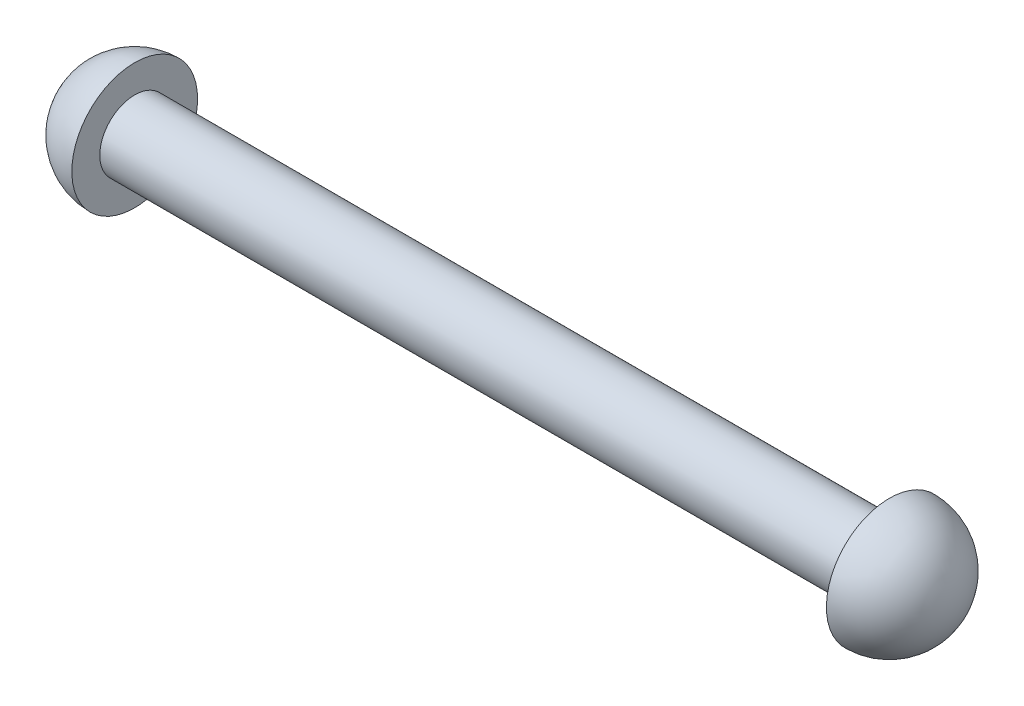
ISO-10303-21;
HEADER;
FILE_DESCRIPTION(('STEP AP214'),'2;1');
FILE_NAME('part.step','',(''),(''),'','','');
FILE_SCHEMA(('AUTOMOTIVE_DESIGN { 1 0 10303 214 1 1 1 1 }'));
ENDSEC;
DATA;
#1=APPLICATION_CONTEXT('core data for automotive mechanical design processes');
#2=APPLICATION_PROTOCOL_DEFINITION('international standard','automotive_design',2000,#1);
#3=PRODUCT_CONTEXT('',#1,'mechanical');
#4=PRODUCT('Part','Part','',(#3));
#5=PRODUCT_RELATED_PRODUCT_CATEGORY('part','',(#4));
#6=PRODUCT_DEFINITION_FORMATION('','',#4);
#7=PRODUCT_DEFINITION_CONTEXT('part definition',#1,'design');
#8=PRODUCT_DEFINITION('design','',#6,#7);
#9=PRODUCT_DEFINITION_SHAPE('','',#8);
#10=(LENGTH_UNIT() NAMED_UNIT(*) SI_UNIT(.MILLI.,.METRE.));
#11=(NAMED_UNIT(*) PLANE_ANGLE_UNIT() SI_UNIT($,.RADIAN.));
#12=(NAMED_UNIT(*) SI_UNIT($,.STERADIAN.) SOLID_ANGLE_UNIT());
#13=UNCERTAINTY_MEASURE_WITH_UNIT(LENGTH_MEASURE(1.E-05),#10,'distance_accuracy_value','');
#14=(GEOMETRIC_REPRESENTATION_CONTEXT(3) GLOBAL_UNCERTAINTY_ASSIGNED_CONTEXT((#13)) GLOBAL_UNIT_ASSIGNED_CONTEXT((#10,
#11,#12)) REPRESENTATION_CONTEXT('',''));
#15=CARTESIAN_POINT('',(0.,0.,0.));
#16=DIRECTION('',(0.,0.,1.));
#17=DIRECTION('',(1.,0.,0.));
#18=AXIS2_PLACEMENT_3D('',#15,#16,#17);
#19=CARTESIAN_POINT('',(34.29,3.17499999999999,0.));
#20=DIRECTION('',(-1.,0.,0.));
#21=DIRECTION('',(0.,0.,1.));
#22=AXIS2_PLACEMENT_3D('',#19,#20,#21);
#23=PLANE('',#22);
#24=CARTESIAN_POINT('',(34.29,0.,0.));
#25=DIRECTION('',(1.,0.,0.));
#26=DIRECTION('',(0.,0.,-1.));
#27=AXIS2_PLACEMENT_3D('',#24,#25,#26);
#28=CIRCLE('',#27,3.17500000000001);
#29=CARTESIAN_POINT('',(34.29,0.,-3.17500000000001));
#30=VERTEX_POINT('',#29);
#31=EDGE_CURVE('E58',#30,#30,#28,.T.);
#32=ORIENTED_EDGE('',*,*,#31,.T.);
#33=EDGE_LOOP('',(#32));
#34=FACE_BOUND('',#33,.T.);
#35=CARTESIAN_POINT('',(34.29,0.,0.));
#36=DIRECTION('',(1.,0.,0.));
#37=DIRECTION('',(0.,0.,-1.));
#38=AXIS2_PLACEMENT_3D('',#35,#36,#37);
#39=CIRCLE('',#38,5.71500000000001);
#40=CARTESIAN_POINT('',(34.29,0.,-5.71500000000001));
#41=VERTEX_POINT('',#40);
#42=EDGE_CURVE('E10',#41,#41,#39,.T.);
#43=ORIENTED_EDGE('',*,*,#42,.F.);
#44=EDGE_LOOP('',(#43));
#45=FACE_BOUND('',#44,.T.);
#46=ADVANCED_FACE('F41',(#34,#45),#23,.T.);
#47=CARTESIAN_POINT('',(34.29,0.,0.));
#48=DIRECTION('',(1.,0.,0.));
#49=DIRECTION('',(0.,-1.,0.));
#50=AXIS2_PLACEMENT_3D('',#47,#48,#49);
#51=SPHERICAL_SURFACE('',#50,5.715);
#52=ORIENTED_EDGE('',*,*,#42,.T.);
#53=EDGE_LOOP('',(#52));
#54=FACE_BOUND('',#53,.T.);
#55=ADVANCED_FACE('F78',(#54),#51,.T.);
#56=CARTESIAN_POINT('',(-34.29,0.,0.));
#57=DIRECTION('',(1.,0.,0.));
#58=DIRECTION('',(0.,1.,0.));
#59=AXIS2_PLACEMENT_3D('',#56,#57,#58);
#60=SPHERICAL_SURFACE('',#59,5.715);
#61=CARTESIAN_POINT('',(-34.29,0.,0.));
#62=DIRECTION('',(1.,0.,0.));
#63=DIRECTION('',(0.,0.,-1.));
#64=AXIS2_PLACEMENT_3D('',#61,#62,#63);
#65=CIRCLE('',#64,5.71500000000001);
#66=CARTESIAN_POINT('',(-34.29,0.,-5.71500000000001));
#67=VERTEX_POINT('',#66);
#68=EDGE_CURVE('E48',#67,#67,#65,.T.);
#69=ORIENTED_EDGE('',*,*,#68,.F.);
#70=EDGE_LOOP('',(#69));
#71=FACE_BOUND('',#70,.T.);
#72=ADVANCED_FACE('F75',(#71),#60,.T.);
#73=CARTESIAN_POINT('',(-34.29,3.17499999999999,0.));
#74=DIRECTION('',(1.,0.,0.));
#75=DIRECTION('',(0.,0.,-1.));
#76=AXIS2_PLACEMENT_3D('',#73,#74,#75);
#77=PLANE('',#76);
#78=ORIENTED_EDGE('',*,*,#68,.T.);
#79=EDGE_LOOP('',(#78));
#80=FACE_BOUND('',#79,.T.);
#81=CARTESIAN_POINT('',(-34.29,0.,0.));
#82=DIRECTION('',(1.,0.,0.));
#83=DIRECTION('',(0.,0.,-1.));
#84=AXIS2_PLACEMENT_3D('',#81,#82,#83);
#85=CIRCLE('',#84,3.17500000000001);
#86=CARTESIAN_POINT('',(-34.29,0.,-3.17500000000001));
#87=VERTEX_POINT('',#86);
#88=EDGE_CURVE('E53',#87,#87,#85,.T.);
#89=ORIENTED_EDGE('',*,*,#88,.F.);
#90=EDGE_LOOP('',(#89));
#91=FACE_BOUND('',#90,.T.);
#92=ADVANCED_FACE('F69',(#80,#91),#77,.T.);
#93=CARTESIAN_POINT('',(40.005,0.,0.));
#94=DIRECTION('',(1.,0.,0.));
#95=DIRECTION('',(0.,0.,-1.));
#96=AXIS2_PLACEMENT_3D('',#93,#94,#95);
#97=CYLINDRICAL_SURFACE('',#96,3.17500000000001);
#98=ORIENTED_EDGE('',*,*,#88,.T.);
#99=EDGE_LOOP('',(#98));
#100=FACE_BOUND('',#99,.T.);
#101=ORIENTED_EDGE('',*,*,#31,.F.);
#102=EDGE_LOOP('',(#101));
#103=FACE_BOUND('',#102,.T.);
#104=ADVANCED_FACE('F67',(#100,#103),#97,.T.);
#105=CLOSED_SHELL('',(#46,#55,#72,#92,#104));
#106=MANIFOLD_SOLID_BREP('B2',#105);
#107=ADVANCED_BREP_SHAPE_REPRESENTATION('',(#18,#106),#14);
#108=SHAPE_DEFINITION_REPRESENTATION(#9,#107);
ENDSEC;
END-ISO-10303-21;
